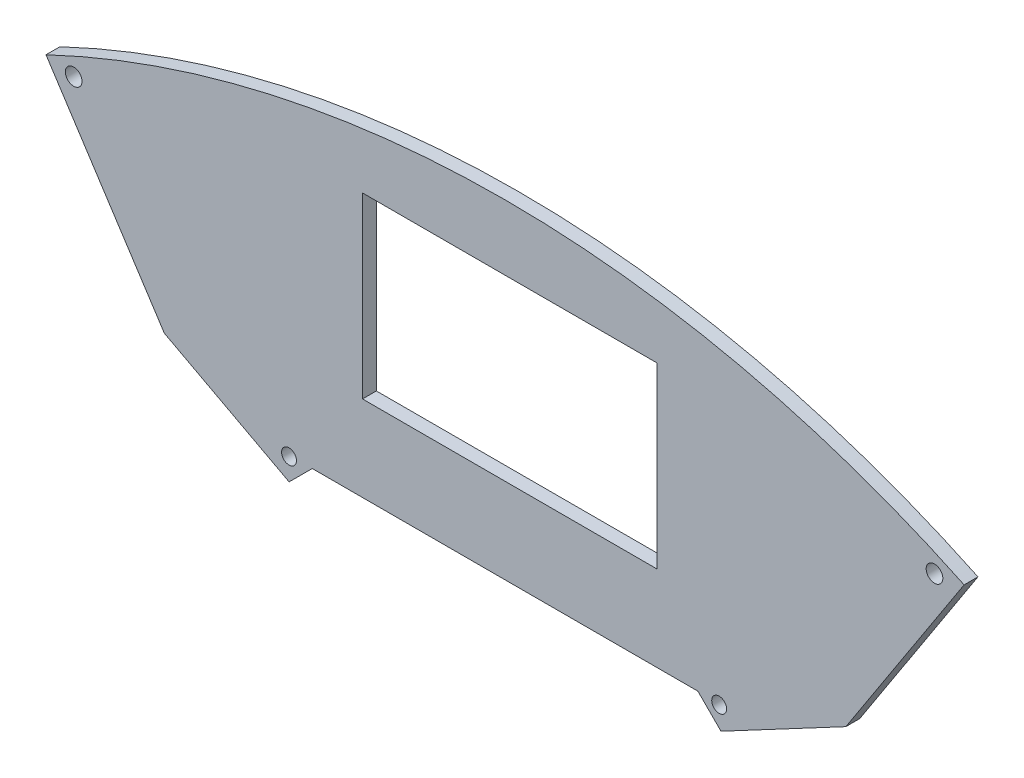
ISO-10303-21;
HEADER;
FILE_DESCRIPTION(('STEP AP214'),'2;1');
FILE_NAME('part.step','',(''),(''),'','','');
FILE_SCHEMA(('AUTOMOTIVE_DESIGN { 1 0 10303 214 1 1 1 1 }'));
ENDSEC;
DATA;
#1=APPLICATION_CONTEXT('core data for automotive mechanical design processes');
#2=APPLICATION_PROTOCOL_DEFINITION('international standard','automotive_design',2000,#1);
#3=PRODUCT_CONTEXT('',#1,'mechanical');
#4=PRODUCT('Part','Part','',(#3));
#5=PRODUCT_RELATED_PRODUCT_CATEGORY('part','',(#4));
#6=PRODUCT_DEFINITION_FORMATION('','',#4);
#7=PRODUCT_DEFINITION_CONTEXT('part definition',#1,'design');
#8=PRODUCT_DEFINITION('design','',#6,#7);
#9=PRODUCT_DEFINITION_SHAPE('','',#8);
#10=(LENGTH_UNIT() NAMED_UNIT(*) SI_UNIT(.MILLI.,.METRE.));
#11=(NAMED_UNIT(*) PLANE_ANGLE_UNIT() SI_UNIT($,.RADIAN.));
#12=(NAMED_UNIT(*) SI_UNIT($,.STERADIAN.) SOLID_ANGLE_UNIT());
#13=UNCERTAINTY_MEASURE_WITH_UNIT(LENGTH_MEASURE(1.E-05),#10,'distance_accuracy_value','');
#14=(GEOMETRIC_REPRESENTATION_CONTEXT(3) GLOBAL_UNCERTAINTY_ASSIGNED_CONTEXT((#13)) GLOBAL_UNIT_ASSIGNED_CONTEXT((#10,
#11,#12)) REPRESENTATION_CONTEXT('',''));
#15=CARTESIAN_POINT('',(0.,0.,0.));
#16=DIRECTION('',(0.,0.,1.));
#17=DIRECTION('',(1.,0.,0.));
#18=AXIS2_PLACEMENT_3D('',#15,#16,#17);
#19=CARTESIAN_POINT('',(1.62701149425325,-259.334051724141,4.));
#20=DIRECTION('',(0.,0.,-1.));
#21=DIRECTION('',(-1.,0.,0.));
#22=AXIS2_PLACEMENT_3D('',#19,#20,#21);
#23=PLANE('',#22);
#24=CARTESIAN_POINT('',(-122.881880971691,16.8045371869603,4.));
#25=DIRECTION('',(0.,0.,-1.));
#26=DIRECTION('',(-1.,0.,0.));
#27=AXIS2_PLACEMENT_3D('',#24,#25,#26);
#28=CIRCLE('',#27,2.40454982667789);
#29=CARTESIAN_POINT('',(-125.286430798369,16.8045371869603,4.));
#30=VERTEX_POINT('',#29);
#31=EDGE_CURVE('E149',#30,#30,#28,.T.);
#32=ORIENTED_EDGE('',*,*,#31,.T.);
#33=EDGE_LOOP('',(#32));
#34=FACE_BOUND('',#33,.T.);
#35=CARTESIAN_POINT('',(-60.7281399538195,-47.0585659613019,4.));
#36=DIRECTION('',(0.,0.,-1.));
#37=DIRECTION('',(-1.,0.,0.));
#38=AXIS2_PLACEMENT_3D('',#35,#36,#37);
#39=CIRCLE('',#38,2.15);
#40=CARTESIAN_POINT('',(-62.8781399538195,-47.0585659613019,4.));
#41=VERTEX_POINT('',#40);
#42=EDGE_CURVE('E230',#41,#41,#39,.T.);
#43=ORIENTED_EDGE('',*,*,#42,.T.);
#44=EDGE_LOOP('',(#43));
#45=FACE_BOUND('',#44,.T.);
#46=CARTESIAN_POINT('',(63.4202088394284,-47.0585659613019,4.));
#47=DIRECTION('',(0.,0.,-1.));
#48=DIRECTION('',(-1.,0.,0.));
#49=AXIS2_PLACEMENT_3D('',#46,#47,#48);
#50=CIRCLE('',#49,2.15);
#51=CARTESIAN_POINT('',(61.2702088394284,-47.0585659613019,4.));
#52=VERTEX_POINT('',#51);
#53=EDGE_CURVE('E227',#52,#52,#50,.T.);
#54=ORIENTED_EDGE('',*,*,#53,.T.);
#55=EDGE_LOOP('',(#54));
#56=FACE_BOUND('',#55,.T.);
#57=CARTESIAN_POINT('',(125.5739498573,16.8045371869603,4.));
#58=DIRECTION('',(0.,0.,-1.));
#59=DIRECTION('',(-1.,0.,0.));
#60=AXIS2_PLACEMENT_3D('',#57,#58,#59);
#61=CIRCLE('',#60,2.4045498266779);
#62=CARTESIAN_POINT('',(123.169400030622,16.8045371869603,4.));
#63=VERTEX_POINT('',#62);
#64=EDGE_CURVE('E224',#63,#63,#61,.T.);
#65=ORIENTED_EDGE('',*,*,#64,.T.);
#66=EDGE_LOOP('',(#65));
#67=FACE_BOUND('',#66,.T.);
#68=DIRECTION('',(0.8829383241339,0.469488994307236,0.));
#69=VECTOR('',#68,1.);
#70=CARTESIAN_POINT('',(63.9549593167995,-53.4078328800177,4.));
#71=LINE('',#70,#69);
#72=CARTESIAN_POINT('',(63.9549593167995,-53.4078328800177,4.));
#73=VERTEX_POINT('',#72);
#74=CARTESIAN_POINT('',(99.9780007013989,-34.2531297605972,4.));
#75=VERTEX_POINT('',#74);
#76=EDGE_CURVE('E168',#73,#75,#71,.T.);
#77=ORIENTED_EDGE('',*,*,#76,.T.);
#78=DIRECTION('',(0.545088234219341,0.838378683481182,0.));
#79=VECTOR('',#78,1.);
#80=CARTESIAN_POINT('',(99.9780007013989,-34.2531297605972,4.));
#81=LINE('',#80,#79);
#82=CARTESIAN_POINT('',(134.127011494253,18.2701149425291,4.));
#83=VERTEX_POINT('',#82);
#84=EDGE_CURVE('E171',#75,#83,#81,.T.);
#85=ORIENTED_EDGE('',*,*,#84,.T.);
#86=CARTESIAN_POINT('',(1.62701149425325,-259.334051724141,4.));
#87=DIRECTION('',(0.,0.,1.));
#88=DIRECTION('',(-1.,0.,0.));
#89=AXIS2_PLACEMENT_3D('',#86,#87,#88);
#90=CIRCLE('',#89,307.604166666669);
#91=CARTESIAN_POINT('',(-130.872988505747,18.2701149425287,4.));
#92=VERTEX_POINT('',#91);
#93=EDGE_CURVE('E174',#83,#92,#90,.T.);
#94=ORIENTED_EDGE('',*,*,#93,.T.);
#95=DIRECTION('',(0.545088234219344,-0.838378683481181,0.));
#96=VECTOR('',#95,1.);
#97=CARTESIAN_POINT('',(-96.723977712893,-34.2531297605975,4.));
#98=LINE('',#97,#96);
#99=CARTESIAN_POINT('',(-96.723977712893,-34.2531297605975,4.));
#100=VERTEX_POINT('',#99);
#101=EDGE_CURVE('E176',#92,#100,#98,.T.);
#102=ORIENTED_EDGE('',*,*,#101,.T.);
#103=DIRECTION('',(0.882938324133902,-0.469488994307233,0.));
#104=VECTOR('',#103,1.);
#105=CARTESIAN_POINT('',(-60.7009363282935,-53.4078328800179,4.));
#106=LINE('',#105,#104);
#107=CARTESIAN_POINT('',(-60.7009363282935,-53.4078328800179,4.));
#108=VERTEX_POINT('',#107);
#109=EDGE_CURVE('E178',#100,#108,#106,.T.);
#110=ORIENTED_EDGE('',*,*,#109,.T.);
#111=DIRECTION('',(0.707106781186541,0.707106781186554,0.));
#112=VECTOR('',#111,1.);
#113=CARTESIAN_POINT('',(-54.022988505747,-46.7298850574713,4.));
#114=LINE('',#113,#112);
#115=CARTESIAN_POINT('',(-54.022988505747,-46.7298850574713,4.));
#116=VERTEX_POINT('',#115);
#117=EDGE_CURVE('E180',#108,#116,#114,.T.);
#118=ORIENTED_EDGE('',*,*,#117,.T.);
#119=DIRECTION('',(1.,0.,0.));
#120=VECTOR('',#119,1.);
#121=CARTESIAN_POINT('',(-54.022988505747,-46.7298850574713,4.));
#122=LINE('',#121,#120);
#123=CARTESIAN_POINT('',(57.277011494253,-46.7298850574711,4.));
#124=VERTEX_POINT('',#123);
#125=EDGE_CURVE('E182',#116,#124,#122,.T.);
#126=ORIENTED_EDGE('',*,*,#125,.T.);
#127=DIRECTION('',(0.707106781186542,-0.707106781186553,0.));
#128=VECTOR('',#127,1.);
#129=CARTESIAN_POINT('',(57.277011494253,-46.7298850574711,4.));
#130=LINE('',#129,#128);
#131=EDGE_CURVE('E184',#124,#73,#130,.T.);
#132=ORIENTED_EDGE('',*,*,#131,.T.);
#133=EDGE_LOOP('',(#77,#85,#94,#102,#110,#118,#126,#132));
#134=FACE_BOUND('',#133,.T.);
#135=DIRECTION('',(0.,-1.,0.));
#136=VECTOR('',#135,1.);
#137=CARTESIAN_POINT('',(-39.522988505747,-259.334051724141,4.));
#138=LINE('',#137,#136);
#139=CARTESIAN_POINT('',(-39.5229885057471,29.4123161679806,4.));
#140=VERTEX_POINT('',#139);
#141=CARTESIAN_POINT('',(-39.5229885057471,-22.0876838320194,4.));
#142=VERTEX_POINT('',#141);
#143=EDGE_CURVE('E131',#140,#142,#138,.T.);
#144=ORIENTED_EDGE('',*,*,#143,.F.);
#145=DIRECTION('',(-1.,0.,0.));
#146=VECTOR('',#145,1.);
#147=CARTESIAN_POINT('',(1.62701149425325,29.4123161679806,4.));
#148=LINE('',#147,#146);
#149=CARTESIAN_POINT('',(45.4770114942529,29.4123161679806,4.));
#150=VERTEX_POINT('',#149);
#151=EDGE_CURVE('E134',#150,#140,#148,.T.);
#152=ORIENTED_EDGE('',*,*,#151,.F.);
#153=DIRECTION('',(0.,1.,0.));
#154=VECTOR('',#153,1.);
#155=CARTESIAN_POINT('',(45.4770114942529,-259.334051724141,4.));
#156=LINE('',#155,#154);
#157=CARTESIAN_POINT('',(45.4770114942529,-22.0876838320194,4.));
#158=VERTEX_POINT('',#157);
#159=EDGE_CURVE('E162',#158,#150,#156,.T.);
#160=ORIENTED_EDGE('',*,*,#159,.F.);
#161=DIRECTION('',(1.,0.,0.));
#162=VECTOR('',#161,1.);
#163=CARTESIAN_POINT('',(1.62701149425325,-22.0876838320194,4.));
#164=LINE('',#163,#162);
#165=EDGE_CURVE('E164',#142,#158,#164,.T.);
#166=ORIENTED_EDGE('',*,*,#165,.F.);
#167=EDGE_LOOP('',(#144,#152,#160,#166));
#168=FACE_BOUND('',#167,.T.);
#169=ADVANCED_FACE('F37',(#34,#45,#56,#67,#134,#168),#23,.F.);
#170=CARTESIAN_POINT('',(1.62701149425325,-259.334051724141,0.));
#171=DIRECTION('',(0.,0.,-1.));
#172=DIRECTION('',(-1.,0.,0.));
#173=AXIS2_PLACEMENT_3D('',#170,#171,#172);
#174=PLANE('',#173);
#175=CARTESIAN_POINT('',(-122.881880971691,16.8045371869603,0.));
#176=DIRECTION('',(0.,0.,-1.));
#177=DIRECTION('',(-1.,0.,0.));
#178=AXIS2_PLACEMENT_3D('',#175,#176,#177);
#179=CIRCLE('',#178,2.40454982667789);
#180=CARTESIAN_POINT('',(-125.286430798369,16.8045371869603,0.));
#181=VERTEX_POINT('',#180);
#182=EDGE_CURVE('E41',#181,#181,#179,.T.);
#183=ORIENTED_EDGE('',*,*,#182,.F.);
#184=EDGE_LOOP('',(#183));
#185=FACE_BOUND('',#184,.T.);
#186=CARTESIAN_POINT('',(-60.7281399538195,-47.0585659613019,0.));
#187=DIRECTION('',(0.,0.,-1.));
#188=DIRECTION('',(-1.,0.,0.));
#189=AXIS2_PLACEMENT_3D('',#186,#187,#188);
#190=CIRCLE('',#189,2.15);
#191=CARTESIAN_POINT('',(-62.8781399538195,-47.0585659613019,0.));
#192=VERTEX_POINT('',#191);
#193=EDGE_CURVE('E228',#192,#192,#190,.T.);
#194=ORIENTED_EDGE('',*,*,#193,.F.);
#195=EDGE_LOOP('',(#194));
#196=FACE_BOUND('',#195,.T.);
#197=CARTESIAN_POINT('',(63.4202088394284,-47.0585659613019,0.));
#198=DIRECTION('',(0.,0.,-1.));
#199=DIRECTION('',(-1.,0.,0.));
#200=AXIS2_PLACEMENT_3D('',#197,#198,#199);
#201=CIRCLE('',#200,2.15);
#202=CARTESIAN_POINT('',(61.2702088394284,-47.0585659613019,0.));
#203=VERTEX_POINT('',#202);
#204=EDGE_CURVE('E225',#203,#203,#201,.T.);
#205=ORIENTED_EDGE('',*,*,#204,.F.);
#206=EDGE_LOOP('',(#205));
#207=FACE_BOUND('',#206,.T.);
#208=CARTESIAN_POINT('',(125.5739498573,16.8045371869603,0.));
#209=DIRECTION('',(0.,0.,-1.));
#210=DIRECTION('',(-1.,0.,0.));
#211=AXIS2_PLACEMENT_3D('',#208,#209,#210);
#212=CIRCLE('',#211,2.4045498266779);
#213=CARTESIAN_POINT('',(123.169400030622,16.8045371869603,0.));
#214=VERTEX_POINT('',#213);
#215=EDGE_CURVE('E221',#214,#214,#212,.T.);
#216=ORIENTED_EDGE('',*,*,#215,.F.);
#217=EDGE_LOOP('',(#216));
#218=FACE_BOUND('',#217,.T.);
#219=DIRECTION('',(0.8829383241339,0.469488994307236,0.));
#220=VECTOR('',#219,1.);
#221=CARTESIAN_POINT('',(63.9549593167995,-53.4078328800177,0.));
#222=LINE('',#221,#220);
#223=CARTESIAN_POINT('',(63.9549593167995,-53.4078328800177,0.));
#224=VERTEX_POINT('',#223);
#225=CARTESIAN_POINT('',(99.9780007013989,-34.2531297605972,0.));
#226=VERTEX_POINT('',#225);
#227=EDGE_CURVE('E167',#224,#226,#222,.T.);
#228=ORIENTED_EDGE('',*,*,#227,.F.);
#229=DIRECTION('',(0.707106781186542,-0.707106781186553,0.));
#230=VECTOR('',#229,1.);
#231=CARTESIAN_POINT('',(57.277011494253,-46.7298850574711,0.));
#232=LINE('',#231,#230);
#233=CARTESIAN_POINT('',(57.277011494253,-46.7298850574711,0.));
#234=VERTEX_POINT('',#233);
#235=EDGE_CURVE('E172',#234,#224,#232,.T.);
#236=ORIENTED_EDGE('',*,*,#235,.F.);
#237=DIRECTION('',(1.,0.,0.));
#238=VECTOR('',#237,1.);
#239=CARTESIAN_POINT('',(-54.022988505747,-46.7298850574713,0.));
#240=LINE('',#239,#238);
#241=CARTESIAN_POINT('',(-54.022988505747,-46.7298850574713,0.));
#242=VERTEX_POINT('',#241);
#243=EDGE_CURVE('E199',#242,#234,#240,.T.);
#244=ORIENTED_EDGE('',*,*,#243,.F.);
#245=DIRECTION('',(0.707106781186541,0.707106781186554,0.));
#246=VECTOR('',#245,1.);
#247=CARTESIAN_POINT('',(-54.022988505747,-46.7298850574713,0.));
#248=LINE('',#247,#246);
#249=CARTESIAN_POINT('',(-60.7009363282935,-53.4078328800179,0.));
#250=VERTEX_POINT('',#249);
#251=EDGE_CURVE('E197',#250,#242,#248,.T.);
#252=ORIENTED_EDGE('',*,*,#251,.F.);
#253=DIRECTION('',(0.882938324133902,-0.469488994307233,0.));
#254=VECTOR('',#253,1.);
#255=CARTESIAN_POINT('',(-60.7009363282935,-53.4078328800179,0.));
#256=LINE('',#255,#254);
#257=CARTESIAN_POINT('',(-96.723977712893,-34.2531297605975,0.));
#258=VERTEX_POINT('',#257);
#259=EDGE_CURVE('E195',#258,#250,#256,.T.);
#260=ORIENTED_EDGE('',*,*,#259,.F.);
#261=DIRECTION('',(0.545088234219344,-0.838378683481181,0.));
#262=VECTOR('',#261,1.);
#263=CARTESIAN_POINT('',(-96.723977712893,-34.2531297605975,0.));
#264=LINE('',#263,#262);
#265=CARTESIAN_POINT('',(-130.872988505747,18.2701149425287,0.));
#266=VERTEX_POINT('',#265);
#267=EDGE_CURVE('E193',#266,#258,#264,.T.);
#268=ORIENTED_EDGE('',*,*,#267,.F.);
#269=CARTESIAN_POINT('',(1.62701149425325,-259.334051724141,0.));
#270=DIRECTION('',(0.,0.,1.));
#271=DIRECTION('',(-1.,0.,0.));
#272=AXIS2_PLACEMENT_3D('',#269,#270,#271);
#273=CIRCLE('',#272,307.604166666669);
#274=CARTESIAN_POINT('',(134.127011494253,18.2701149425291,0.));
#275=VERTEX_POINT('',#274);
#276=EDGE_CURVE('E191',#275,#266,#273,.T.);
#277=ORIENTED_EDGE('',*,*,#276,.F.);
#278=DIRECTION('',(0.545088234219341,0.838378683481182,0.));
#279=VECTOR('',#278,1.);
#280=CARTESIAN_POINT('',(99.9780007013989,-34.2531297605972,0.));
#281=LINE('',#280,#279);
#282=EDGE_CURVE('E189',#226,#275,#281,.T.);
#283=ORIENTED_EDGE('',*,*,#282,.F.);
#284=EDGE_LOOP('',(#228,#236,#244,#252,#260,#268,#277,#283));
#285=FACE_BOUND('',#284,.T.);
#286=DIRECTION('',(-1.,0.,0.));
#287=VECTOR('',#286,1.);
#288=CARTESIAN_POINT('',(-39.5229885057471,29.4123161679806,0.));
#289=LINE('',#288,#287);
#290=CARTESIAN_POINT('',(45.4770114942529,29.4123161679806,0.));
#291=VERTEX_POINT('',#290);
#292=CARTESIAN_POINT('',(-39.5229885057471,29.4123161679806,0.));
#293=VERTEX_POINT('',#292);
#294=EDGE_CURVE('E148',#291,#293,#289,.T.);
#295=ORIENTED_EDGE('',*,*,#294,.T.);
#296=DIRECTION('',(0.,-1.,0.));
#297=VECTOR('',#296,1.);
#298=CARTESIAN_POINT('',(-39.5229885057471,29.4123161679806,0.));
#299=LINE('',#298,#297);
#300=CARTESIAN_POINT('',(-39.5229885057471,-22.0876838320194,0.));
#301=VERTEX_POINT('',#300);
#302=EDGE_CURVE('E62',#293,#301,#299,.T.);
#303=ORIENTED_EDGE('',*,*,#302,.T.);
#304=DIRECTION('',(1.,0.,0.));
#305=VECTOR('',#304,1.);
#306=CARTESIAN_POINT('',(-39.5229885057471,-22.0876838320194,0.));
#307=LINE('',#306,#305);
#308=CARTESIAN_POINT('',(45.4770114942529,-22.0876838320194,0.));
#309=VERTEX_POINT('',#308);
#310=EDGE_CURVE('E138',#301,#309,#307,.T.);
#311=ORIENTED_EDGE('',*,*,#310,.T.);
#312=DIRECTION('',(0.,1.,0.));
#313=VECTOR('',#312,1.);
#314=CARTESIAN_POINT('',(45.4770114942529,29.4123161679806,0.));
#315=LINE('',#314,#313);
#316=EDGE_CURVE('E144',#309,#291,#315,.T.);
#317=ORIENTED_EDGE('',*,*,#316,.T.);
#318=EDGE_LOOP('',(#295,#303,#311,#317));
#319=FACE_BOUND('',#318,.T.);
#320=ADVANCED_FACE('F147',(#185,#196,#207,#218,#285,#319),#174,.T.);
#321=CARTESIAN_POINT('',(63.9549593167995,-53.4078328800177,4.));
#322=DIRECTION('',(-0.469488994307236,0.8829383241339,0.));
#323=DIRECTION('',(-0.8829383241339,-0.469488994307236,0.));
#324=AXIS2_PLACEMENT_3D('',#321,#322,#323);
#325=PLANE('',#324);
#326=ORIENTED_EDGE('',*,*,#227,.T.);
#327=DIRECTION('',(0.,0.,-1.));
#328=VECTOR('',#327,1.);
#329=CARTESIAN_POINT('',(99.9780007013989,-34.2531297605972,4.));
#330=LINE('',#329,#328);
#331=EDGE_CURVE('E11',#75,#226,#330,.T.);
#332=ORIENTED_EDGE('',*,*,#331,.F.);
#333=ORIENTED_EDGE('',*,*,#76,.F.);
#334=DIRECTION('',(0.,0.,-1.));
#335=VECTOR('',#334,1.);
#336=CARTESIAN_POINT('',(63.9549593167995,-53.4078328800177,4.));
#337=LINE('',#336,#335);
#338=EDGE_CURVE('E186',#73,#224,#337,.T.);
#339=ORIENTED_EDGE('',*,*,#338,.T.);
#340=EDGE_LOOP('',(#326,#332,#333,#339));
#341=FACE_BOUND('',#340,.T.);
#342=ADVANCED_FACE('F39',(#341),#325,.F.);
#343=CARTESIAN_POINT('',(99.9780007013989,-34.2531297605972,4.));
#344=DIRECTION('',(-0.838378683481182,0.545088234219341,0.));
#345=DIRECTION('',(-0.545088234219341,-0.838378683481182,0.));
#346=AXIS2_PLACEMENT_3D('',#343,#344,#345);
#347=PLANE('',#346);
#348=ORIENTED_EDGE('',*,*,#282,.T.);
#349=DIRECTION('',(0.,0.,-1.));
#350=VECTOR('',#349,1.);
#351=CARTESIAN_POINT('',(134.127011494253,18.2701149425291,4.));
#352=LINE('',#351,#350);
#353=EDGE_CURVE('E46',#83,#275,#352,.T.);
#354=ORIENTED_EDGE('',*,*,#353,.F.);
#355=ORIENTED_EDGE('',*,*,#84,.F.);
#356=ORIENTED_EDGE('',*,*,#331,.T.);
#357=EDGE_LOOP('',(#348,#354,#355,#356));
#358=FACE_BOUND('',#357,.T.);
#359=ADVANCED_FACE('F293',(#358),#347,.F.);
#360=CARTESIAN_POINT('',(1.62701149425325,-259.334051724141,4.));
#361=DIRECTION('',(0.,0.,-1.));
#362=DIRECTION('',(-1.,0.,0.));
#363=AXIS2_PLACEMENT_3D('',#360,#361,#362);
#364=CYLINDRICAL_SURFACE('',#363,307.604166666669);
#365=ORIENTED_EDGE('',*,*,#276,.T.);
#366=DIRECTION('',(0.,0.,-1.));
#367=VECTOR('',#366,1.);
#368=CARTESIAN_POINT('',(-130.872988505747,18.2701149425287,4.));
#369=LINE('',#368,#367);
#370=EDGE_CURVE('E216',#92,#266,#369,.T.);
#371=ORIENTED_EDGE('',*,*,#370,.F.);
#372=ORIENTED_EDGE('',*,*,#93,.F.);
#373=ORIENTED_EDGE('',*,*,#353,.T.);
#374=EDGE_LOOP('',(#365,#371,#372,#373));
#375=FACE_BOUND('',#374,.T.);
#376=ADVANCED_FACE('F290',(#375),#364,.T.);
#377=CARTESIAN_POINT('',(-96.723977712893,-34.2531297605975,4.));
#378=DIRECTION('',(0.838378683481181,0.545088234219344,0.));
#379=DIRECTION('',(-0.545088234219343,0.838378683481181,0.));
#380=AXIS2_PLACEMENT_3D('',#377,#378,#379);
#381=PLANE('',#380);
#382=ORIENTED_EDGE('',*,*,#267,.T.);
#383=DIRECTION('',(0.,0.,-1.));
#384=VECTOR('',#383,1.);
#385=CARTESIAN_POINT('',(-96.723977712893,-34.2531297605975,4.));
#386=LINE('',#385,#384);
#387=EDGE_CURVE('E213',#100,#258,#386,.T.);
#388=ORIENTED_EDGE('',*,*,#387,.F.);
#389=ORIENTED_EDGE('',*,*,#101,.F.);
#390=ORIENTED_EDGE('',*,*,#370,.T.);
#391=EDGE_LOOP('',(#382,#388,#389,#390));
#392=FACE_BOUND('',#391,.T.);
#393=ADVANCED_FACE('F286',(#392),#381,.F.);
#394=CARTESIAN_POINT('',(-60.7009363282935,-53.4078328800179,4.));
#395=DIRECTION('',(0.469488994307233,0.882938324133902,0.));
#396=DIRECTION('',(-0.882938324133902,0.469488994307233,0.));
#397=AXIS2_PLACEMENT_3D('',#394,#395,#396);
#398=PLANE('',#397);
#399=ORIENTED_EDGE('',*,*,#259,.T.);
#400=DIRECTION('',(0.,0.,-1.));
#401=VECTOR('',#400,1.);
#402=CARTESIAN_POINT('',(-60.7009363282935,-53.4078328800179,4.));
#403=LINE('',#402,#401);
#404=EDGE_CURVE('E210',#108,#250,#403,.T.);
#405=ORIENTED_EDGE('',*,*,#404,.F.);
#406=ORIENTED_EDGE('',*,*,#109,.F.);
#407=ORIENTED_EDGE('',*,*,#387,.T.);
#408=EDGE_LOOP('',(#399,#405,#406,#407));
#409=FACE_BOUND('',#408,.T.);
#410=ADVANCED_FACE('F282',(#409),#398,.F.);
#411=CARTESIAN_POINT('',(-54.022988505747,-46.7298850574713,4.));
#412=DIRECTION('',(-0.707106781186554,0.707106781186541,0.));
#413=DIRECTION('',(-0.707106781186541,-0.707106781186554,0.));
#414=AXIS2_PLACEMENT_3D('',#411,#412,#413);
#415=PLANE('',#414);
#416=ORIENTED_EDGE('',*,*,#251,.T.);
#417=DIRECTION('',(0.,0.,-1.));
#418=VECTOR('',#417,1.);
#419=CARTESIAN_POINT('',(-54.022988505747,-46.7298850574713,4.));
#420=LINE('',#419,#418);
#421=EDGE_CURVE('E207',#116,#242,#420,.T.);
#422=ORIENTED_EDGE('',*,*,#421,.F.);
#423=ORIENTED_EDGE('',*,*,#117,.F.);
#424=ORIENTED_EDGE('',*,*,#404,.T.);
#425=EDGE_LOOP('',(#416,#422,#423,#424));
#426=FACE_BOUND('',#425,.T.);
#427=ADVANCED_FACE('F278',(#426),#415,.F.);
#428=CARTESIAN_POINT('',(-54.022988505747,-46.7298850574713,4.));
#429=DIRECTION('',(0.,1.,0.));
#430=DIRECTION('',(-1.,0.,0.));
#431=AXIS2_PLACEMENT_3D('',#428,#429,#430);
#432=PLANE('',#431);
#433=ORIENTED_EDGE('',*,*,#243,.T.);
#434=DIRECTION('',(0.,0.,-1.));
#435=VECTOR('',#434,1.);
#436=CARTESIAN_POINT('',(57.277011494253,-46.7298850574711,4.));
#437=LINE('',#436,#435);
#438=EDGE_CURVE('E204',#124,#234,#437,.T.);
#439=ORIENTED_EDGE('',*,*,#438,.F.);
#440=ORIENTED_EDGE('',*,*,#125,.F.);
#441=ORIENTED_EDGE('',*,*,#421,.T.);
#442=EDGE_LOOP('',(#433,#439,#440,#441));
#443=FACE_BOUND('',#442,.T.);
#444=ADVANCED_FACE('F274',(#443),#432,.F.);
#445=CARTESIAN_POINT('',(57.277011494253,-46.7298850574711,4.));
#446=DIRECTION('',(0.707106781186553,0.707106781186542,0.));
#447=DIRECTION('',(-0.707106781186542,0.707106781186553,0.));
#448=AXIS2_PLACEMENT_3D('',#445,#446,#447);
#449=PLANE('',#448);
#450=ORIENTED_EDGE('',*,*,#235,.T.);
#451=ORIENTED_EDGE('',*,*,#338,.F.);
#452=ORIENTED_EDGE('',*,*,#131,.F.);
#453=ORIENTED_EDGE('',*,*,#438,.T.);
#454=EDGE_LOOP('',(#450,#451,#452,#453));
#455=FACE_BOUND('',#454,.T.);
#456=ADVANCED_FACE('F271',(#455),#449,.F.);
#457=CARTESIAN_POINT('',(-39.5229885057471,29.4123161679806,20.));
#458=DIRECTION('',(1.,0.,0.));
#459=DIRECTION('',(0.,1.,0.));
#460=AXIS2_PLACEMENT_3D('',#457,#458,#459);
#461=PLANE('',#460);
#462=ORIENTED_EDGE('',*,*,#143,.T.);
#463=DIRECTION('',(0.,0.,-1.));
#464=VECTOR('',#463,1.);
#465=CARTESIAN_POINT('',(-39.5229885057471,-22.0876838320194,20.));
#466=LINE('',#465,#464);
#467=EDGE_CURVE('E127',#142,#301,#466,.T.);
#468=ORIENTED_EDGE('',*,*,#467,.T.);
#469=ORIENTED_EDGE('',*,*,#302,.F.);
#470=DIRECTION('',(0.,0.,-1.));
#471=VECTOR('',#470,1.);
#472=CARTESIAN_POINT('',(-39.5229885057471,29.4123161679806,20.));
#473=LINE('',#472,#471);
#474=EDGE_CURVE('E157',#140,#293,#473,.T.);
#475=ORIENTED_EDGE('',*,*,#474,.F.);
#476=EDGE_LOOP('',(#462,#468,#469,#475));
#477=FACE_BOUND('',#476,.T.);
#478=ADVANCED_FACE('F129',(#477),#461,.T.);
#479=CARTESIAN_POINT('',(-39.5229885057471,-22.0876838320194,20.));
#480=DIRECTION('',(0.,1.,0.));
#481=DIRECTION('',(0.,0.,1.));
#482=AXIS2_PLACEMENT_3D('',#479,#480,#481);
#483=PLANE('',#482);
#484=ORIENTED_EDGE('',*,*,#165,.T.);
#485=DIRECTION('',(0.,0.,-1.));
#486=VECTOR('',#485,1.);
#487=CARTESIAN_POINT('',(45.4770114942529,-22.0876838320194,20.));
#488=LINE('',#487,#486);
#489=EDGE_CURVE('E135',#158,#309,#488,.T.);
#490=ORIENTED_EDGE('',*,*,#489,.T.);
#491=ORIENTED_EDGE('',*,*,#310,.F.);
#492=ORIENTED_EDGE('',*,*,#467,.F.);
#493=EDGE_LOOP('',(#484,#490,#491,#492));
#494=FACE_BOUND('',#493,.T.);
#495=ADVANCED_FACE('F139',(#494),#483,.T.);
#496=CARTESIAN_POINT('',(45.4770114942529,29.4123161679806,20.));
#497=DIRECTION('',(-1.,0.,0.));
#498=DIRECTION('',(0.,0.,1.));
#499=AXIS2_PLACEMENT_3D('',#496,#497,#498);
#500=PLANE('',#499);
#501=ORIENTED_EDGE('',*,*,#159,.T.);
#502=DIRECTION('',(0.,0.,-1.));
#503=VECTOR('',#502,1.);
#504=CARTESIAN_POINT('',(45.4770114942529,29.4123161679806,20.));
#505=LINE('',#504,#503);
#506=EDGE_CURVE('E54',#150,#291,#505,.T.);
#507=ORIENTED_EDGE('',*,*,#506,.T.);
#508=ORIENTED_EDGE('',*,*,#316,.F.);
#509=ORIENTED_EDGE('',*,*,#489,.F.);
#510=EDGE_LOOP('',(#501,#507,#508,#509));
#511=FACE_BOUND('',#510,.T.);
#512=ADVANCED_FACE('F257',(#511),#500,.T.);
#513=CARTESIAN_POINT('',(-39.5229885057471,29.4123161679806,20.));
#514=DIRECTION('',(0.,-1.,0.));
#515=DIRECTION('',(0.,0.,-1.));
#516=AXIS2_PLACEMENT_3D('',#513,#514,#515);
#517=PLANE('',#516);
#518=ORIENTED_EDGE('',*,*,#151,.T.);
#519=ORIENTED_EDGE('',*,*,#474,.T.);
#520=ORIENTED_EDGE('',*,*,#294,.F.);
#521=ORIENTED_EDGE('',*,*,#506,.F.);
#522=EDGE_LOOP('',(#518,#519,#520,#521));
#523=FACE_BOUND('',#522,.T.);
#524=ADVANCED_FACE('F247',(#523),#517,.T.);
#525=CARTESIAN_POINT('',(125.5739498573,16.8045371869603,-10.));
#526=DIRECTION('',(0.,0.,1.));
#527=DIRECTION('',(1.,0.,0.));
#528=AXIS2_PLACEMENT_3D('',#525,#526,#527);
#529=CYLINDRICAL_SURFACE('',#528,2.4045498266779);
#530=ORIENTED_EDGE('',*,*,#215,.T.);
#531=EDGE_LOOP('',(#530));
#532=FACE_BOUND('',#531,.T.);
#533=ORIENTED_EDGE('',*,*,#64,.F.);
#534=EDGE_LOOP('',(#533));
#535=FACE_BOUND('',#534,.T.);
#536=ADVANCED_FACE('F244',(#532,#535),#529,.F.);
#537=CARTESIAN_POINT('',(63.4202088394284,-47.0585659613019,-10.));
#538=DIRECTION('',(0.,0.,1.));
#539=DIRECTION('',(1.,0.,0.));
#540=AXIS2_PLACEMENT_3D('',#537,#538,#539);
#541=CYLINDRICAL_SURFACE('',#540,2.15);
#542=ORIENTED_EDGE('',*,*,#204,.T.);
#543=EDGE_LOOP('',(#542));
#544=FACE_BOUND('',#543,.T.);
#545=ORIENTED_EDGE('',*,*,#53,.F.);
#546=EDGE_LOOP('',(#545));
#547=FACE_BOUND('',#546,.T.);
#548=ADVANCED_FACE('F246',(#544,#547),#541,.F.);
#549=CARTESIAN_POINT('',(-60.7281399538195,-47.0585659613019,-10.));
#550=DIRECTION('',(0.,0.,1.));
#551=DIRECTION('',(1.,0.,0.));
#552=AXIS2_PLACEMENT_3D('',#549,#550,#551);
#553=CYLINDRICAL_SURFACE('',#552,2.15);
#554=ORIENTED_EDGE('',*,*,#193,.T.);
#555=EDGE_LOOP('',(#554));
#556=FACE_BOUND('',#555,.T.);
#557=ORIENTED_EDGE('',*,*,#42,.F.);
#558=EDGE_LOOP('',(#557));
#559=FACE_BOUND('',#558,.T.);
#560=ADVANCED_FACE('F254',(#556,#559),#553,.F.);
#561=CARTESIAN_POINT('',(-122.881880971691,16.8045371869603,-10.));
#562=DIRECTION('',(0.,0.,1.));
#563=DIRECTION('',(1.,0.,0.));
#564=AXIS2_PLACEMENT_3D('',#561,#562,#563);
#565=CYLINDRICAL_SURFACE('',#564,2.40454982667789);
#566=ORIENTED_EDGE('',*,*,#182,.T.);
#567=EDGE_LOOP('',(#566));
#568=FACE_BOUND('',#567,.T.);
#569=ORIENTED_EDGE('',*,*,#31,.F.);
#570=EDGE_LOOP('',(#569));
#571=FACE_BOUND('',#570,.T.);
#572=ADVANCED_FACE('F407',(#568,#571),#565,.F.);
#573=CLOSED_SHELL('',(#169,#320,#342,#359,#376,#393,#410,#427,#444,#456,#478,#495,#512,#524,
#536,#548,#560,#572));
#574=MANIFOLD_SOLID_BREP('B2',#573);
#575=ADVANCED_BREP_SHAPE_REPRESENTATION('',(#18,#574),#14);
#576=SHAPE_DEFINITION_REPRESENTATION(#9,#575);
ENDSEC;
END-ISO-10303-21;
